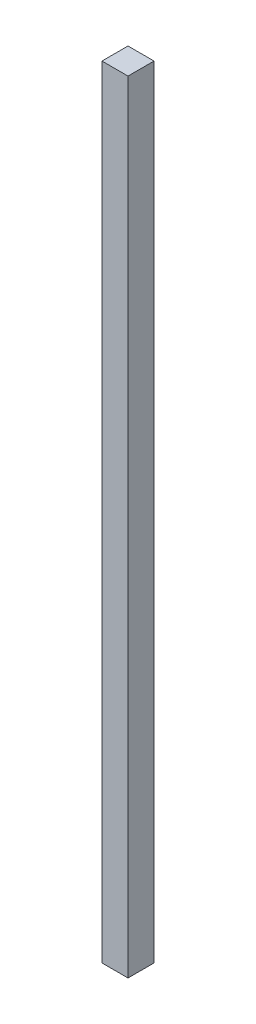
ISO-10303-21;
HEADER;
FILE_DESCRIPTION(('STEP AP214'),'2;1');
FILE_NAME('part.step','',(''),(''),'','','');
FILE_SCHEMA(('AUTOMOTIVE_DESIGN { 1 0 10303 214 1 1 1 1 }'));
ENDSEC;
DATA;
#1=APPLICATION_CONTEXT('core data for automotive mechanical design processes');
#2=APPLICATION_PROTOCOL_DEFINITION('international standard','automotive_design',2000,#1);
#3=PRODUCT_CONTEXT('',#1,'mechanical');
#4=PRODUCT('Part','Part','',(#3));
#5=PRODUCT_RELATED_PRODUCT_CATEGORY('part','',(#4));
#6=PRODUCT_DEFINITION_FORMATION('','',#4);
#7=PRODUCT_DEFINITION_CONTEXT('part definition',#1,'design');
#8=PRODUCT_DEFINITION('design','',#6,#7);
#9=PRODUCT_DEFINITION_SHAPE('','',#8);
#10=(LENGTH_UNIT() NAMED_UNIT(*) SI_UNIT(.MILLI.,.METRE.));
#11=(NAMED_UNIT(*) PLANE_ANGLE_UNIT() SI_UNIT($,.RADIAN.));
#12=(NAMED_UNIT(*) SI_UNIT($,.STERADIAN.) SOLID_ANGLE_UNIT());
#13=UNCERTAINTY_MEASURE_WITH_UNIT(LENGTH_MEASURE(1.E-05),#10,'distance_accuracy_value','');
#14=(GEOMETRIC_REPRESENTATION_CONTEXT(3) GLOBAL_UNCERTAINTY_ASSIGNED_CONTEXT((#13)) GLOBAL_UNIT_ASSIGNED_CONTEXT((#10,
#11,#12)) REPRESENTATION_CONTEXT('',''));
#15=CARTESIAN_POINT('',(0.,0.,0.));
#16=DIRECTION('',(0.,0.,1.));
#17=DIRECTION('',(1.,0.,0.));
#18=AXIS2_PLACEMENT_3D('',#15,#16,#17);
#19=CARTESIAN_POINT('',(0.,600.,0.));
#20=DIRECTION('',(1.,0.,0.));
#21=DIRECTION('',(0.,0.,-1.));
#22=AXIS2_PLACEMENT_3D('',#19,#20,#21);
#23=PLANE('',#22);
#24=DIRECTION('',(0.,0.,1.));
#25=VECTOR('',#24,1.);
#26=CARTESIAN_POINT('',(0.,0.,0.));
#27=LINE('',#26,#25);
#28=CARTESIAN_POINT('',(0.,0.,0.));
#29=VERTEX_POINT('',#28);
#30=CARTESIAN_POINT('',(0.,0.,20.));
#31=VERTEX_POINT('',#30);
#32=EDGE_CURVE('E95',#29,#31,#27,.T.);
#33=ORIENTED_EDGE('',*,*,#32,.T.);
#34=DIRECTION('',(0.,-1.,0.));
#35=VECTOR('',#34,1.);
#36=CARTESIAN_POINT('',(0.,600.,20.));
#37=LINE('',#36,#35);
#38=CARTESIAN_POINT('',(0.,600.,20.));
#39=VERTEX_POINT('',#38);
#40=EDGE_CURVE('E11',#39,#31,#37,.T.);
#41=ORIENTED_EDGE('',*,*,#40,.F.);
#42=DIRECTION('',(0.,0.,1.));
#43=VECTOR('',#42,1.);
#44=CARTESIAN_POINT('',(0.,600.,0.));
#45=LINE('',#44,#43);
#46=CARTESIAN_POINT('',(0.,600.,0.));
#47=VERTEX_POINT('',#46);
#48=EDGE_CURVE('E83',#47,#39,#45,.T.);
#49=ORIENTED_EDGE('',*,*,#48,.F.);
#50=DIRECTION('',(0.,-1.,0.));
#51=VECTOR('',#50,1.);
#52=CARTESIAN_POINT('',(0.,600.,0.));
#53=LINE('',#52,#51);
#54=EDGE_CURVE('E91',#47,#29,#53,.T.);
#55=ORIENTED_EDGE('',*,*,#54,.T.);
#56=EDGE_LOOP('',(#33,#41,#49,#55));
#57=FACE_BOUND('',#56,.T.);
#58=ADVANCED_FACE('F32',(#57),#23,.F.);
#59=CARTESIAN_POINT('',(0.,600.,20.));
#60=DIRECTION('',(0.,0.,-1.));
#61=DIRECTION('',(-1.,0.,0.));
#62=AXIS2_PLACEMENT_3D('',#59,#60,#61);
#63=PLANE('',#62);
#64=DIRECTION('',(1.,0.,0.));
#65=VECTOR('',#64,1.);
#66=CARTESIAN_POINT('',(0.,0.,20.));
#67=LINE('',#66,#65);
#68=CARTESIAN_POINT('',(20.,0.,20.));
#69=VERTEX_POINT('',#68);
#70=EDGE_CURVE('E87',#31,#69,#67,.T.);
#71=ORIENTED_EDGE('',*,*,#70,.T.);
#72=DIRECTION('',(0.,-1.,0.));
#73=VECTOR('',#72,1.);
#74=CARTESIAN_POINT('',(20.,600.,20.));
#75=LINE('',#74,#73);
#76=CARTESIAN_POINT('',(20.,600.,20.));
#77=VERTEX_POINT('',#76);
#78=EDGE_CURVE('E40',#77,#69,#75,.T.);
#79=ORIENTED_EDGE('',*,*,#78,.F.);
#80=DIRECTION('',(1.,0.,0.));
#81=VECTOR('',#80,1.);
#82=CARTESIAN_POINT('',(0.,600.,20.));
#83=LINE('',#82,#81);
#84=EDGE_CURVE('E78',#39,#77,#83,.T.);
#85=ORIENTED_EDGE('',*,*,#84,.F.);
#86=ORIENTED_EDGE('',*,*,#40,.T.);
#87=EDGE_LOOP('',(#71,#79,#85,#86));
#88=FACE_BOUND('',#87,.T.);
#89=ADVANCED_FACE('F86',(#88),#63,.F.);
#90=CARTESIAN_POINT('',(20.,600.,0.));
#91=DIRECTION('',(-1.,0.,0.));
#92=DIRECTION('',(0.,0.,1.));
#93=AXIS2_PLACEMENT_3D('',#90,#91,#92);
#94=PLANE('',#93);
#95=DIRECTION('',(0.,0.,-1.));
#96=VECTOR('',#95,1.);
#97=CARTESIAN_POINT('',(20.,0.,0.));
#98=LINE('',#97,#96);
#99=CARTESIAN_POINT('',(20.,0.,0.));
#100=VERTEX_POINT('',#99);
#101=EDGE_CURVE('E65',#69,#100,#98,.T.);
#102=ORIENTED_EDGE('',*,*,#101,.T.);
#103=DIRECTION('',(0.,-1.,0.));
#104=VECTOR('',#103,1.);
#105=CARTESIAN_POINT('',(20.,600.,0.));
#106=LINE('',#105,#104);
#107=CARTESIAN_POINT('',(20.,600.,0.));
#108=VERTEX_POINT('',#107);
#109=EDGE_CURVE('E88',#108,#100,#106,.T.);
#110=ORIENTED_EDGE('',*,*,#109,.F.);
#111=DIRECTION('',(0.,0.,-1.));
#112=VECTOR('',#111,1.);
#113=CARTESIAN_POINT('',(20.,600.,0.));
#114=LINE('',#113,#112);
#115=EDGE_CURVE('E81',#77,#108,#114,.T.);
#116=ORIENTED_EDGE('',*,*,#115,.F.);
#117=ORIENTED_EDGE('',*,*,#78,.T.);
#118=EDGE_LOOP('',(#102,#110,#116,#117));
#119=FACE_BOUND('',#118,.T.);
#120=ADVANCED_FACE('F89',(#119),#94,.F.);
#121=CARTESIAN_POINT('',(0.,600.,0.));
#122=DIRECTION('',(0.,0.,1.));
#123=DIRECTION('',(1.,0.,0.));
#124=AXIS2_PLACEMENT_3D('',#121,#122,#123);
#125=PLANE('',#124);
#126=DIRECTION('',(-1.,0.,0.));
#127=VECTOR('',#126,1.);
#128=CARTESIAN_POINT('',(0.,0.,0.));
#129=LINE('',#128,#127);
#130=EDGE_CURVE('E71',#100,#29,#129,.T.);
#131=ORIENTED_EDGE('',*,*,#130,.T.);
#132=ORIENTED_EDGE('',*,*,#54,.F.);
#133=DIRECTION('',(-1.,0.,0.));
#134=VECTOR('',#133,1.);
#135=CARTESIAN_POINT('',(0.,600.,0.));
#136=LINE('',#135,#134);
#137=EDGE_CURVE('E48',#108,#47,#136,.T.);
#138=ORIENTED_EDGE('',*,*,#137,.F.);
#139=ORIENTED_EDGE('',*,*,#109,.T.);
#140=EDGE_LOOP('',(#131,#132,#138,#139));
#141=FACE_BOUND('',#140,.T.);
#142=ADVANCED_FACE('F102',(#141),#125,.F.);
#143=CARTESIAN_POINT('',(0.,600.,0.));
#144=DIRECTION('',(0.,1.,0.));
#145=DIRECTION('',(0.,0.,1.));
#146=AXIS2_PLACEMENT_3D('',#143,#144,#145);
#147=PLANE('',#146);
#148=ORIENTED_EDGE('',*,*,#48,.T.);
#149=ORIENTED_EDGE('',*,*,#84,.T.);
#150=ORIENTED_EDGE('',*,*,#115,.T.);
#151=ORIENTED_EDGE('',*,*,#137,.T.);
#152=EDGE_LOOP('',(#148,#149,#150,#151));
#153=FACE_BOUND('',#152,.T.);
#154=ADVANCED_FACE('F79',(#153),#147,.T.);
#155=CARTESIAN_POINT('',(0.,0.,0.));
#156=DIRECTION('',(0.,1.,0.));
#157=DIRECTION('',(0.,0.,1.));
#158=AXIS2_PLACEMENT_3D('',#155,#156,#157);
#159=PLANE('',#158);
#160=ORIENTED_EDGE('',*,*,#32,.F.);
#161=ORIENTED_EDGE('',*,*,#130,.F.);
#162=ORIENTED_EDGE('',*,*,#101,.F.);
#163=ORIENTED_EDGE('',*,*,#70,.F.);
#164=EDGE_LOOP('',(#160,#161,#162,#163));
#165=FACE_BOUND('',#164,.T.);
#166=ADVANCED_FACE('F105',(#165),#159,.F.);
#167=CLOSED_SHELL('',(#58,#89,#120,#142,#154,#166));
#168=MANIFOLD_SOLID_BREP('B2',#167);
#169=ADVANCED_BREP_SHAPE_REPRESENTATION('',(#18,#168),#14);
#170=SHAPE_DEFINITION_REPRESENTATION(#9,#169);
ENDSEC;
END-ISO-10303-21;
